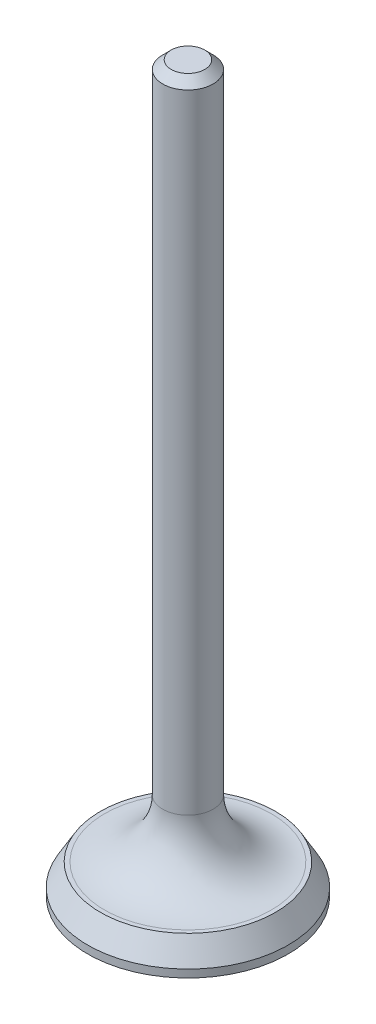
ISO-10303-21;
HEADER;
FILE_DESCRIPTION(('STEP AP214'),'2;1');
FILE_NAME('part.step','',(''),(''),'','','');
FILE_SCHEMA(('AUTOMOTIVE_DESIGN { 1 0 10303 214 1 1 1 1 }'));
ENDSEC;
DATA;
#1=APPLICATION_CONTEXT('core data for automotive mechanical design processes');
#2=APPLICATION_PROTOCOL_DEFINITION('international standard','automotive_design',2000,#1);
#3=PRODUCT_CONTEXT('',#1,'mechanical');
#4=PRODUCT('Part','Part','',(#3));
#5=PRODUCT_RELATED_PRODUCT_CATEGORY('part','',(#4));
#6=PRODUCT_DEFINITION_FORMATION('','',#4);
#7=PRODUCT_DEFINITION_CONTEXT('part definition',#1,'design');
#8=PRODUCT_DEFINITION('design','',#6,#7);
#9=PRODUCT_DEFINITION_SHAPE('','',#8);
#10=(LENGTH_UNIT() NAMED_UNIT(*) SI_UNIT(.MILLI.,.METRE.));
#11=(NAMED_UNIT(*) PLANE_ANGLE_UNIT() SI_UNIT($,.RADIAN.));
#12=(NAMED_UNIT(*) SI_UNIT($,.STERADIAN.) SOLID_ANGLE_UNIT());
#13=UNCERTAINTY_MEASURE_WITH_UNIT(LENGTH_MEASURE(1.E-05),#10,'distance_accuracy_value','');
#14=(GEOMETRIC_REPRESENTATION_CONTEXT(3) GLOBAL_UNCERTAINTY_ASSIGNED_CONTEXT((#13)) GLOBAL_UNIT_ASSIGNED_CONTEXT((#10,
#11,#12)) REPRESENTATION_CONTEXT('',''));
#15=CARTESIAN_POINT('',(0.,0.,0.));
#16=DIRECTION('',(0.,0.,1.));
#17=DIRECTION('',(1.,0.,0.));
#18=AXIS2_PLACEMENT_3D('',#15,#16,#17);
#19=CARTESIAN_POINT('',(0.,0.,0.));
#20=DIRECTION('',(0.,-1.,0.));
#21=DIRECTION('',(0.,0.,-1.));
#22=AXIS2_PLACEMENT_3D('',#19,#20,#21);
#23=PLANE('',#22);
#24=CARTESIAN_POINT('',(0.,0.,0.));
#25=DIRECTION('',(0.,-1.,0.));
#26=DIRECTION('',(0.,0.,-1.));
#27=AXIS2_PLACEMENT_3D('',#24,#25,#26);
#28=CIRCLE('',#27,15.5);
#29=CARTESIAN_POINT('',(0.,0.,-15.5));
#30=VERTEX_POINT('',#29);
#31=EDGE_CURVE('E60',#30,#30,#28,.T.);
#32=ORIENTED_EDGE('',*,*,#31,.T.);
#33=EDGE_LOOP('',(#32));
#34=FACE_BOUND('',#33,.T.);
#35=ADVANCED_FACE('F35',(#34),#23,.T.);
#36=CARTESIAN_POINT('',(0.,112.,0.));
#37=DIRECTION('',(0.,1.,0.));
#38=DIRECTION('',(0.,0.,1.));
#39=AXIS2_PLACEMENT_3D('',#36,#37,#38);
#40=PLANE('',#39);
#41=CARTESIAN_POINT('',(0.,112.,0.));
#42=DIRECTION('',(0.,-1.,0.));
#43=DIRECTION('',(0.,0.,-1.));
#44=AXIS2_PLACEMENT_3D('',#41,#42,#43);
#45=CIRCLE('',#44,2.6);
#46=CARTESIAN_POINT('',(0.,112.,-2.6));
#47=VERTEX_POINT('',#46);
#48=EDGE_CURVE('E10',#47,#47,#45,.T.);
#49=ORIENTED_EDGE('',*,*,#48,.F.);
#50=EDGE_LOOP('',(#49));
#51=FACE_BOUND('',#50,.T.);
#52=ADVANCED_FACE('F77',(#51),#40,.T.);
#53=CARTESIAN_POINT('',(0.,110.7,0.));
#54=DIRECTION('',(0.,-1.,0.));
#55=DIRECTION('',(0.,0.,-1.));
#56=AXIS2_PLACEMENT_3D('',#53,#54,#55);
#57=CONICAL_SURFACE('',#56,3.90000000000002,0.785398163397458);
#58=ORIENTED_EDGE('',*,*,#48,.T.);
#59=EDGE_LOOP('',(#58));
#60=FACE_BOUND('',#59,.T.);
#61=CARTESIAN_POINT('',(0.,110.7,0.));
#62=DIRECTION('',(0.,-1.,0.));
#63=DIRECTION('',(0.,0.,-1.));
#64=AXIS2_PLACEMENT_3D('',#61,#62,#63);
#65=CIRCLE('',#64,3.90000000000002);
#66=CARTESIAN_POINT('',(0.,110.7,-3.90000000000002));
#67=VERTEX_POINT('',#66);
#68=EDGE_CURVE('E41',#67,#67,#65,.T.);
#69=ORIENTED_EDGE('',*,*,#68,.F.);
#70=EDGE_LOOP('',(#69));
#71=FACE_BOUND('',#70,.T.);
#72=ADVANCED_FACE('F81',(#60,#71),#57,.T.);
#73=CARTESIAN_POINT('',(0.,0.,0.));
#74=DIRECTION('',(0.,-1.,0.));
#75=DIRECTION('',(0.,0.,-1.));
#76=AXIS2_PLACEMENT_3D('',#73,#74,#75);
#77=CYLINDRICAL_SURFACE('',#76,3.90000000000003);
#78=ORIENTED_EDGE('',*,*,#68,.T.);
#79=EDGE_LOOP('',(#78));
#80=FACE_BOUND('',#79,.T.);
#81=CARTESIAN_POINT('',(0.,13.6,0.));
#82=DIRECTION('',(0.,-1.,0.));
#83=DIRECTION('',(0.,0.,-1.));
#84=AXIS2_PLACEMENT_3D('',#81,#82,#83);
#85=CIRCLE('',#84,3.90000000000004);
#86=CARTESIAN_POINT('',(0.,13.6,-3.90000000000004));
#87=VERTEX_POINT('',#86);
#88=EDGE_CURVE('E45',#87,#87,#85,.T.);
#89=ORIENTED_EDGE('',*,*,#88,.F.);
#90=EDGE_LOOP('',(#89));
#91=FACE_BOUND('',#90,.T.);
#92=ADVANCED_FACE('F86',(#80,#91),#77,.T.);
#93=CARTESIAN_POINT('',(0.,13.6,0.));
#94=DIRECTION('',(0.,-1.,0.));
#95=DIRECTION('',(0.,0.,-1.));
#96=AXIS2_PLACEMENT_3D('',#93,#94,#95);
#97=TOROIDAL_SURFACE('',#96,12.9,9.);
#98=ORIENTED_EDGE('',*,*,#88,.T.);
#99=EDGE_LOOP('',(#98));
#100=FACE_BOUND('',#99,.T.);
#101=CARTESIAN_POINT('',(0.,4.6,0.));
#102=DIRECTION('',(0.,-1.,0.));
#103=DIRECTION('',(0.,0.,-1.));
#104=AXIS2_PLACEMENT_3D('',#101,#102,#103);
#105=CIRCLE('',#104,12.9);
#106=CARTESIAN_POINT('',(0.,4.6,-12.9));
#107=VERTEX_POINT('',#106);
#108=EDGE_CURVE('E49',#107,#107,#105,.T.);
#109=ORIENTED_EDGE('',*,*,#108,.F.);
#110=EDGE_LOOP('',(#109));
#111=FACE_BOUND('',#110,.T.);
#112=ADVANCED_FACE('F91',(#100,#111),#97,.F.);
#113=CARTESIAN_POINT('',(13.5370090847553,4.6,0.));
#114=DIRECTION('',(0.,1.,0.));
#115=DIRECTION('',(0.,0.,1.));
#116=AXIS2_PLACEMENT_3D('',#113,#114,#115);
#117=PLANE('',#116);
#118=ORIENTED_EDGE('',*,*,#108,.T.);
#119=EDGE_LOOP('',(#118));
#120=FACE_BOUND('',#119,.T.);
#121=CARTESIAN_POINT('',(0.,4.6,0.));
#122=DIRECTION('',(0.,-1.,0.));
#123=DIRECTION('',(0.,0.,-1.));
#124=AXIS2_PLACEMENT_3D('',#121,#122,#123);
#125=CIRCLE('',#124,13.5370090847553);
#126=CARTESIAN_POINT('',(0.,4.6,-13.5370090847553));
#127=VERTEX_POINT('',#126);
#128=EDGE_CURVE('E54',#127,#127,#125,.T.);
#129=ORIENTED_EDGE('',*,*,#128,.F.);
#130=EDGE_LOOP('',(#129));
#131=FACE_BOUND('',#130,.T.);
#132=ADVANCED_FACE('F73',(#120,#131),#117,.T.);
#133=CARTESIAN_POINT('',(0.,1.2,0.));
#134=DIRECTION('',(0.,-1.,0.));
#135=DIRECTION('',(0.,0.,-1.));
#136=AXIS2_PLACEMENT_3D('',#133,#134,#135);
#137=CONICAL_SURFACE('',#136,15.5,0.5235987755983);
#138=ORIENTED_EDGE('',*,*,#128,.T.);
#139=EDGE_LOOP('',(#138));
#140=FACE_BOUND('',#139,.T.);
#141=CARTESIAN_POINT('',(0.,1.2,0.));
#142=DIRECTION('',(0.,-1.,0.));
#143=DIRECTION('',(0.,0.,-1.));
#144=AXIS2_PLACEMENT_3D('',#141,#142,#143);
#145=CIRCLE('',#144,15.5);
#146=CARTESIAN_POINT('',(0.,1.2,-15.5));
#147=VERTEX_POINT('',#146);
#148=EDGE_CURVE('E57',#147,#147,#145,.T.);
#149=ORIENTED_EDGE('',*,*,#148,.F.);
#150=EDGE_LOOP('',(#149));
#151=FACE_BOUND('',#150,.T.);
#152=ADVANCED_FACE('F67',(#140,#151),#137,.T.);
#153=CARTESIAN_POINT('',(0.,0.,0.));
#154=DIRECTION('',(0.,-1.,0.));
#155=DIRECTION('',(0.,0.,-1.));
#156=AXIS2_PLACEMENT_3D('',#153,#154,#155);
#157=CYLINDRICAL_SURFACE('',#156,15.5);
#158=ORIENTED_EDGE('',*,*,#148,.T.);
#159=EDGE_LOOP('',(#158));
#160=FACE_BOUND('',#159,.T.);
#161=ORIENTED_EDGE('',*,*,#31,.F.);
#162=EDGE_LOOP('',(#161));
#163=FACE_BOUND('',#162,.T.);
#164=ADVANCED_FACE('F65',(#160,#163),#157,.T.);
#165=CLOSED_SHELL('',(#35,#52,#72,#92,#112,#132,#152,#164));
#166=MANIFOLD_SOLID_BREP('B2',#165);
#167=ADVANCED_BREP_SHAPE_REPRESENTATION('',(#18,#166),#14);
#168=SHAPE_DEFINITION_REPRESENTATION(#9,#167);
ENDSEC;
END-ISO-10303-21;
